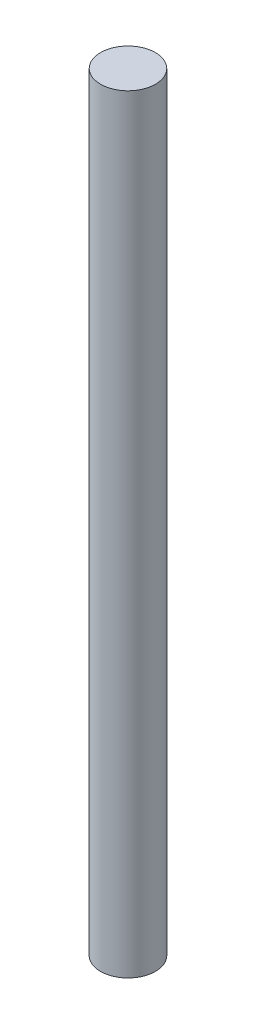
ISO-10303-21;
HEADER;
FILE_DESCRIPTION(('STEP AP214'),'2;1');
FILE_NAME('part.step','',(''),(''),'','','');
FILE_SCHEMA(('AUTOMOTIVE_DESIGN { 1 0 10303 214 1 1 1 1 }'));
ENDSEC;
DATA;
#1=APPLICATION_CONTEXT('core data for automotive mechanical design processes');
#2=APPLICATION_PROTOCOL_DEFINITION('international standard','automotive_design',2000,#1);
#3=PRODUCT_CONTEXT('',#1,'mechanical');
#4=PRODUCT('Part','Part','',(#3));
#5=PRODUCT_RELATED_PRODUCT_CATEGORY('part','',(#4));
#6=PRODUCT_DEFINITION_FORMATION('','',#4);
#7=PRODUCT_DEFINITION_CONTEXT('part definition',#1,'design');
#8=PRODUCT_DEFINITION('design','',#6,#7);
#9=PRODUCT_DEFINITION_SHAPE('','',#8);
#10=(LENGTH_UNIT() NAMED_UNIT(*) SI_UNIT(.MILLI.,.METRE.));
#11=(NAMED_UNIT(*) PLANE_ANGLE_UNIT() SI_UNIT($,.RADIAN.));
#12=(NAMED_UNIT(*) SI_UNIT($,.STERADIAN.) SOLID_ANGLE_UNIT());
#13=UNCERTAINTY_MEASURE_WITH_UNIT(LENGTH_MEASURE(1.E-05),#10,'distance_accuracy_value','');
#14=(GEOMETRIC_REPRESENTATION_CONTEXT(3) GLOBAL_UNCERTAINTY_ASSIGNED_CONTEXT((#13)) GLOBAL_UNIT_ASSIGNED_CONTEXT((#10,
#11,#12)) REPRESENTATION_CONTEXT('',''));
#15=CARTESIAN_POINT('',(0.,0.,0.));
#16=DIRECTION('',(0.,0.,1.));
#17=DIRECTION('',(1.,0.,0.));
#18=AXIS2_PLACEMENT_3D('',#15,#16,#17);
#19=CARTESIAN_POINT('',(0.,14.,0.));
#20=DIRECTION('',(0.,-1.,0.));
#21=DIRECTION('',(0.,0.,-1.));
#22=AXIS2_PLACEMENT_3D('',#19,#20,#21);
#23=CYLINDRICAL_SURFACE('',#22,0.5);
#24=CARTESIAN_POINT('',(0.,14.,0.));
#25=DIRECTION('',(0.,1.,0.));
#26=DIRECTION('',(0.,0.,1.));
#27=AXIS2_PLACEMENT_3D('',#24,#25,#26);
#28=CIRCLE('',#27,0.5);
#29=CARTESIAN_POINT('',(0.,14.,0.5));
#30=VERTEX_POINT('',#29);
#31=EDGE_CURVE('E10',#30,#30,#28,.T.);
#32=ORIENTED_EDGE('',*,*,#31,.F.);
#33=EDGE_LOOP('',(#32));
#34=FACE_BOUND('',#33,.T.);
#35=CARTESIAN_POINT('',(0.,0.,0.));
#36=DIRECTION('',(0.,1.,0.));
#37=DIRECTION('',(0.,0.,1.));
#38=AXIS2_PLACEMENT_3D('',#35,#36,#37);
#39=CIRCLE('',#38,0.5);
#40=CARTESIAN_POINT('',(0.,0.,0.5));
#41=VERTEX_POINT('',#40);
#42=EDGE_CURVE('E40',#41,#41,#39,.T.);
#43=ORIENTED_EDGE('',*,*,#42,.T.);
#44=EDGE_LOOP('',(#43));
#45=FACE_BOUND('',#44,.T.);
#46=ADVANCED_FACE('F37',(#34,#45),#23,.T.);
#47=CARTESIAN_POINT('',(0.,14.,0.));
#48=DIRECTION('',(0.,1.,0.));
#49=DIRECTION('',(0.,0.,1.));
#50=AXIS2_PLACEMENT_3D('',#47,#48,#49);
#51=PLANE('',#50);
#52=ORIENTED_EDGE('',*,*,#31,.T.);
#53=EDGE_LOOP('',(#52));
#54=FACE_BOUND('',#53,.T.);
#55=ADVANCED_FACE('F54',(#54),#51,.T.);
#56=CARTESIAN_POINT('',(0.,0.,0.));
#57=DIRECTION('',(0.,1.,0.));
#58=DIRECTION('',(0.,0.,1.));
#59=AXIS2_PLACEMENT_3D('',#56,#57,#58);
#60=PLANE('',#59);
#61=ORIENTED_EDGE('',*,*,#42,.F.);
#62=EDGE_LOOP('',(#61));
#63=FACE_BOUND('',#62,.T.);
#64=ADVANCED_FACE('F52',(#63),#60,.F.);
#65=CLOSED_SHELL('',(#46,#55,#64));
#66=MANIFOLD_SOLID_BREP('B2',#65);
#67=ADVANCED_BREP_SHAPE_REPRESENTATION('',(#18,#66),#14);
#68=SHAPE_DEFINITION_REPRESENTATION(#9,#67);
ENDSEC;
END-ISO-10303-21;
